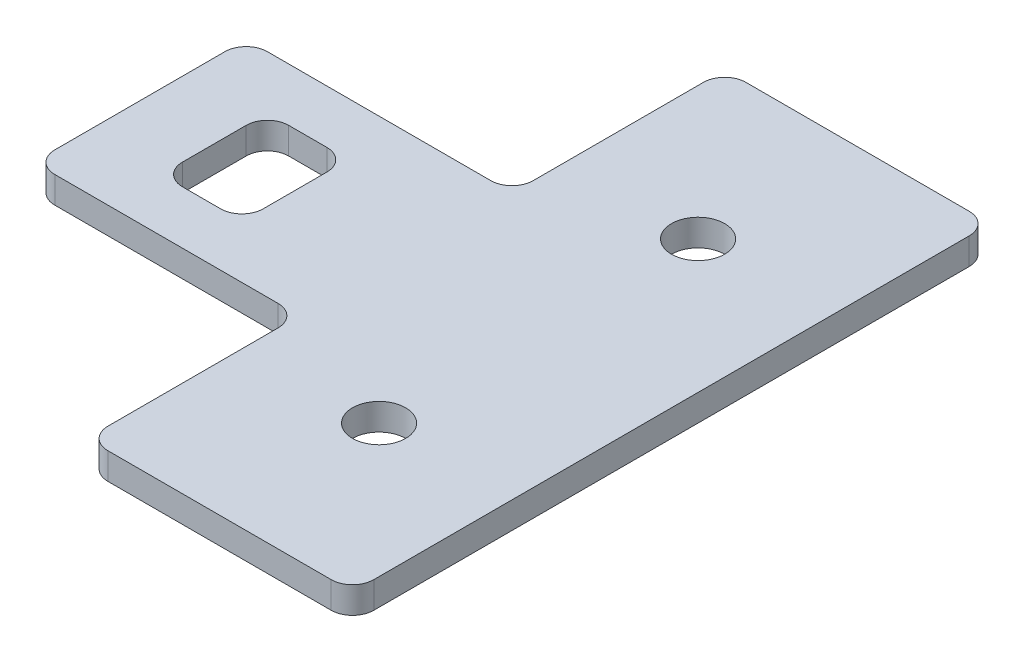
ISO-10303-21;
HEADER;
FILE_DESCRIPTION(('STEP AP214'),'2;1');
FILE_NAME('part.step','',(''),(''),'','','');
FILE_SCHEMA(('AUTOMOTIVE_DESIGN { 1 0 10303 214 1 1 1 1 }'));
ENDSEC;
DATA;
#1=APPLICATION_CONTEXT('core data for automotive mechanical design processes');
#2=APPLICATION_PROTOCOL_DEFINITION('international standard','automotive_design',2000,#1);
#3=PRODUCT_CONTEXT('',#1,'mechanical');
#4=PRODUCT('Part','Part','',(#3));
#5=PRODUCT_RELATED_PRODUCT_CATEGORY('part','',(#4));
#6=PRODUCT_DEFINITION_FORMATION('','',#4);
#7=PRODUCT_DEFINITION_CONTEXT('part definition',#1,'design');
#8=PRODUCT_DEFINITION('design','',#6,#7);
#9=PRODUCT_DEFINITION_SHAPE('','',#8);
#10=(LENGTH_UNIT() NAMED_UNIT(*) SI_UNIT(.MILLI.,.METRE.));
#11=(NAMED_UNIT(*) PLANE_ANGLE_UNIT() SI_UNIT($,.RADIAN.));
#12=(NAMED_UNIT(*) SI_UNIT($,.STERADIAN.) SOLID_ANGLE_UNIT());
#13=UNCERTAINTY_MEASURE_WITH_UNIT(LENGTH_MEASURE(1.E-05),#10,'distance_accuracy_value','');
#14=(GEOMETRIC_REPRESENTATION_CONTEXT(3) GLOBAL_UNCERTAINTY_ASSIGNED_CONTEXT((#13)) GLOBAL_UNIT_ASSIGNED_CONTEXT((#10,
#11,#12)) REPRESENTATION_CONTEXT('',''));
#15=CARTESIAN_POINT('',(0.,0.,0.));
#16=DIRECTION('',(0.,0.,1.));
#17=DIRECTION('',(1.,0.,0.));
#18=AXIS2_PLACEMENT_3D('',#15,#16,#17);
#19=CARTESIAN_POINT('',(-29.21,3.175,10.16));
#20=DIRECTION('',(0.,-1.,0.));
#21=DIRECTION('',(0.,0.,-1.));
#22=AXIS2_PLACEMENT_3D('',#19,#20,#21);
#23=PLANE('',#22);
#24=CARTESIAN_POINT('',(15.875,3.175,19.05));
#25=DIRECTION('',(0.,1.,0.));
#26=DIRECTION('',(0.,0.,-1.));
#27=AXIS2_PLACEMENT_3D('',#24,#25,#26);
#28=CIRCLE('',#27,3.175);
#29=CARTESIAN_POINT('',(15.875,3.175,15.875));
#30=VERTEX_POINT('',#29);
#31=EDGE_CURVE('E263',#30,#30,#28,.T.);
#32=ORIENTED_EDGE('',*,*,#31,.F.);
#33=EDGE_LOOP('',(#32));
#34=FACE_BOUND('',#33,.T.);
#35=CARTESIAN_POINT('',(15.875,3.175,-19.05));
#36=DIRECTION('',(0.,1.,0.));
#37=DIRECTION('',(0.,0.,1.));
#38=AXIS2_PLACEMENT_3D('',#35,#36,#37);
#39=CIRCLE('',#38,3.175);
#40=CARTESIAN_POINT('',(15.875,3.175,-15.875));
#41=VERTEX_POINT('',#40);
#42=EDGE_CURVE('E269',#41,#41,#39,.T.);
#43=ORIENTED_EDGE('',*,*,#42,.F.);
#44=EDGE_LOOP('',(#43));
#45=FACE_BOUND('',#44,.T.);
#46=CARTESIAN_POINT('',(-29.21,3.175,10.16));
#47=DIRECTION('',(0.,1.,0.));
#48=DIRECTION('',(0.,0.,-1.));
#49=AXIS2_PLACEMENT_3D('',#46,#47,#48);
#50=CIRCLE('',#49,2.54);
#51=CARTESIAN_POINT('',(-31.75,3.175,10.16));
#52=VERTEX_POINT('',#51);
#53=CARTESIAN_POINT('',(-29.21,3.175,12.7));
#54=VERTEX_POINT('',#53);
#55=EDGE_CURVE('E275',#52,#54,#50,.T.);
#56=ORIENTED_EDGE('',*,*,#55,.T.);
#57=DIRECTION('',(1.,0.,0.));
#58=VECTOR('',#57,1.);
#59=CARTESIAN_POINT('',(-29.21,3.175,12.7));
#60=LINE('',#59,#58);
#61=CARTESIAN_POINT('',(-2.54000000000003,3.175,12.7));
#62=VERTEX_POINT('',#61);
#63=EDGE_CURVE('E278',#54,#62,#60,.T.);
#64=ORIENTED_EDGE('',*,*,#63,.T.);
#65=CARTESIAN_POINT('',(-2.54000000000001,3.175,15.24));
#66=DIRECTION('',(0.,-1.,0.));
#67=DIRECTION('',(0.,0.,-1.));
#68=AXIS2_PLACEMENT_3D('',#65,#66,#67);
#69=CIRCLE('',#68,2.54);
#70=CARTESIAN_POINT('',(0.,3.175,15.24));
#71=VERTEX_POINT('',#70);
#72=EDGE_CURVE('E281',#62,#71,#69,.T.);
#73=ORIENTED_EDGE('',*,*,#72,.T.);
#74=DIRECTION('',(0.,0.,1.));
#75=VECTOR('',#74,1.);
#76=CARTESIAN_POINT('',(0.,3.175,15.24));
#77=LINE('',#76,#75);
#78=CARTESIAN_POINT('',(0.,3.175,35.56));
#79=VERTEX_POINT('',#78);
#80=EDGE_CURVE('E283',#71,#79,#77,.T.);
#81=ORIENTED_EDGE('',*,*,#80,.T.);
#82=CARTESIAN_POINT('',(2.53999999999999,3.175,35.56));
#83=DIRECTION('',(0.,1.,0.));
#84=DIRECTION('',(0.,0.,1.));
#85=AXIS2_PLACEMENT_3D('',#82,#83,#84);
#86=CIRCLE('',#85,2.54);
#87=CARTESIAN_POINT('',(2.53999999999999,3.175,38.1));
#88=VERTEX_POINT('',#87);
#89=EDGE_CURVE('E285',#79,#88,#86,.T.);
#90=ORIENTED_EDGE('',*,*,#89,.T.);
#91=DIRECTION('',(1.,0.,0.));
#92=VECTOR('',#91,1.);
#93=CARTESIAN_POINT('',(2.54000000000001,3.175,38.1));
#94=LINE('',#93,#92);
#95=CARTESIAN_POINT('',(29.21,3.175,38.1));
#96=VERTEX_POINT('',#95);
#97=EDGE_CURVE('E287',#88,#96,#94,.T.);
#98=ORIENTED_EDGE('',*,*,#97,.T.);
#99=CARTESIAN_POINT('',(29.21,3.175,35.56));
#100=DIRECTION('',(0.,1.,0.));
#101=DIRECTION('',(0.,0.,1.));
#102=AXIS2_PLACEMENT_3D('',#99,#100,#101);
#103=CIRCLE('',#102,2.54);
#104=CARTESIAN_POINT('',(31.75,3.175,35.56));
#105=VERTEX_POINT('',#104);
#106=EDGE_CURVE('E289',#96,#105,#103,.T.);
#107=ORIENTED_EDGE('',*,*,#106,.T.);
#108=DIRECTION('',(0.,0.,-1.));
#109=VECTOR('',#108,1.);
#110=CARTESIAN_POINT('',(31.75,3.175,35.56));
#111=LINE('',#110,#109);
#112=CARTESIAN_POINT('',(31.75,3.175,-35.56));
#113=VERTEX_POINT('',#112);
#114=EDGE_CURVE('E291',#105,#113,#111,.T.);
#115=ORIENTED_EDGE('',*,*,#114,.T.);
#116=CARTESIAN_POINT('',(29.21,3.175,-35.56));
#117=DIRECTION('',(0.,1.,0.));
#118=DIRECTION('',(0.,0.,-1.));
#119=AXIS2_PLACEMENT_3D('',#116,#117,#118);
#120=CIRCLE('',#119,2.54);
#121=CARTESIAN_POINT('',(29.21,3.175,-38.1));
#122=VERTEX_POINT('',#121);
#123=EDGE_CURVE('E293',#113,#122,#120,.T.);
#124=ORIENTED_EDGE('',*,*,#123,.T.);
#125=DIRECTION('',(-1.,0.,0.));
#126=VECTOR('',#125,1.);
#127=CARTESIAN_POINT('',(2.54000000000001,3.175,-38.1));
#128=LINE('',#127,#126);
#129=CARTESIAN_POINT('',(2.54000000000001,3.175,-38.1));
#130=VERTEX_POINT('',#129);
#131=EDGE_CURVE('E295',#122,#130,#128,.T.);
#132=ORIENTED_EDGE('',*,*,#131,.T.);
#133=CARTESIAN_POINT('',(2.53999999999999,3.175,-35.56));
#134=DIRECTION('',(0.,1.,0.));
#135=DIRECTION('',(0.,0.,-1.));
#136=AXIS2_PLACEMENT_3D('',#133,#134,#135);
#137=CIRCLE('',#136,2.54);
#138=CARTESIAN_POINT('',(0.,3.175,-35.56));
#139=VERTEX_POINT('',#138);
#140=EDGE_CURVE('E297',#130,#139,#137,.T.);
#141=ORIENTED_EDGE('',*,*,#140,.T.);
#142=DIRECTION('',(0.,0.,1.));
#143=VECTOR('',#142,1.);
#144=CARTESIAN_POINT('',(0.,3.175,-15.24));
#145=LINE('',#144,#143);
#146=CARTESIAN_POINT('',(0.,3.175,-15.24));
#147=VERTEX_POINT('',#146);
#148=EDGE_CURVE('E299',#139,#147,#145,.T.);
#149=ORIENTED_EDGE('',*,*,#148,.T.);
#150=CARTESIAN_POINT('',(-2.54000000000001,3.175,-15.24));
#151=DIRECTION('',(0.,-1.,0.));
#152=DIRECTION('',(0.,0.,1.));
#153=AXIS2_PLACEMENT_3D('',#150,#151,#152);
#154=CIRCLE('',#153,2.54);
#155=CARTESIAN_POINT('',(-2.54000000000003,3.175,-12.7));
#156=VERTEX_POINT('',#155);
#157=EDGE_CURVE('E301',#147,#156,#154,.T.);
#158=ORIENTED_EDGE('',*,*,#157,.T.);
#159=DIRECTION('',(-1.,0.,0.));
#160=VECTOR('',#159,1.);
#161=CARTESIAN_POINT('',(-29.21,3.175,-12.7));
#162=LINE('',#161,#160);
#163=CARTESIAN_POINT('',(-29.21,3.175,-12.7));
#164=VERTEX_POINT('',#163);
#165=EDGE_CURVE('E303',#156,#164,#162,.T.);
#166=ORIENTED_EDGE('',*,*,#165,.T.);
#167=CARTESIAN_POINT('',(-29.21,3.175,-10.16));
#168=DIRECTION('',(0.,1.,0.));
#169=DIRECTION('',(0.,0.,1.));
#170=AXIS2_PLACEMENT_3D('',#167,#168,#169);
#171=CIRCLE('',#170,2.54);
#172=CARTESIAN_POINT('',(-31.75,3.175,-10.16));
#173=VERTEX_POINT('',#172);
#174=EDGE_CURVE('E305',#164,#173,#171,.T.);
#175=ORIENTED_EDGE('',*,*,#174,.T.);
#176=DIRECTION('',(0.,0.,1.));
#177=VECTOR('',#176,1.);
#178=CARTESIAN_POINT('',(-31.75,3.175,10.16));
#179=LINE('',#178,#177);
#180=EDGE_CURVE('E307',#173,#52,#179,.T.);
#181=ORIENTED_EDGE('',*,*,#180,.T.);
#182=EDGE_LOOP('',(#56,#64,#73,#81,#90,#98,#107,#115,#124,#132,#141,#149,#158,#166,#175,#181));
#183=FACE_BOUND('',#182,.T.);
#184=CARTESIAN_POINT('',(-20.32,3.175,3.81000000000003));
#185=DIRECTION('',(0.,1.,0.));
#186=DIRECTION('',(0.,0.,-1.));
#187=AXIS2_PLACEMENT_3D('',#184,#185,#186);
#188=CIRCLE('',#187,2.54);
#189=CARTESIAN_POINT('',(-22.86,3.175,3.81000000000001));
#190=VERTEX_POINT('',#189);
#191=CARTESIAN_POINT('',(-20.32,3.175,6.35000000000003));
#192=VERTEX_POINT('',#191);
#193=EDGE_CURVE('E198',#190,#192,#188,.T.);
#194=ORIENTED_EDGE('',*,*,#193,.F.);
#195=DIRECTION('',(0.,0.,1.));
#196=VECTOR('',#195,1.);
#197=CARTESIAN_POINT('',(-22.86,3.175,3.81000000000001));
#198=LINE('',#197,#196);
#199=CARTESIAN_POINT('',(-22.86,3.175,-3.80999999999996));
#200=VERTEX_POINT('',#199);
#201=EDGE_CURVE('E231',#200,#190,#198,.T.);
#202=ORIENTED_EDGE('',*,*,#201,.F.);
#203=CARTESIAN_POINT('',(-20.32,3.175,-3.80999999999997));
#204=DIRECTION('',(0.,1.,0.));
#205=DIRECTION('',(0.,0.,-1.));
#206=AXIS2_PLACEMENT_3D('',#203,#204,#205);
#207=CIRCLE('',#206,2.54);
#208=CARTESIAN_POINT('',(-20.32,3.175,-6.34999999999997));
#209=VERTEX_POINT('',#208);
#210=EDGE_CURVE('E229',#209,#200,#207,.T.);
#211=ORIENTED_EDGE('',*,*,#210,.F.);
#212=DIRECTION('',(-1.,0.,0.));
#213=VECTOR('',#212,1.);
#214=CARTESIAN_POINT('',(-20.32,3.175,-6.34999999999997));
#215=LINE('',#214,#213);
#216=CARTESIAN_POINT('',(-15.748,3.175,-6.34999999999998));
#217=VERTEX_POINT('',#216);
#218=EDGE_CURVE('E227',#217,#209,#215,.T.);
#219=ORIENTED_EDGE('',*,*,#218,.F.);
#220=CARTESIAN_POINT('',(-15.748,3.175,-3.80999999999998));
#221=DIRECTION('',(0.,1.,0.));
#222=DIRECTION('',(0.,0.,-1.));
#223=AXIS2_PLACEMENT_3D('',#220,#221,#222);
#224=CIRCLE('',#223,2.54);
#225=CARTESIAN_POINT('',(-13.208,3.175,-3.80999999999996));
#226=VERTEX_POINT('',#225);
#227=EDGE_CURVE('E225',#226,#217,#224,.T.);
#228=ORIENTED_EDGE('',*,*,#227,.F.);
#229=DIRECTION('',(0.,0.,-1.));
#230=VECTOR('',#229,1.);
#231=CARTESIAN_POINT('',(-13.208,3.175,3.81));
#232=LINE('',#231,#230);
#233=CARTESIAN_POINT('',(-13.208,3.175,3.81));
#234=VERTEX_POINT('',#233);
#235=EDGE_CURVE('E221',#234,#226,#232,.T.);
#236=ORIENTED_EDGE('',*,*,#235,.F.);
#237=CARTESIAN_POINT('',(-15.748,3.175,3.81000000000002));
#238=DIRECTION('',(0.,1.,0.));
#239=DIRECTION('',(0.,0.,1.));
#240=AXIS2_PLACEMENT_3D('',#237,#238,#239);
#241=CIRCLE('',#240,2.54);
#242=CARTESIAN_POINT('',(-15.748,3.175,6.35000000000002));
#243=VERTEX_POINT('',#242);
#244=EDGE_CURVE('E219',#243,#234,#241,.T.);
#245=ORIENTED_EDGE('',*,*,#244,.F.);
#246=DIRECTION('',(1.,0.,0.));
#247=VECTOR('',#246,1.);
#248=CARTESIAN_POINT('',(-20.32,3.175,6.35000000000003));
#249=LINE('',#248,#247);
#250=EDGE_CURVE('E206',#192,#243,#249,.T.);
#251=ORIENTED_EDGE('',*,*,#250,.F.);
#252=EDGE_LOOP('',(#194,#202,#211,#219,#228,#236,#245,#251));
#253=FACE_BOUND('',#252,.T.);
#254=ADVANCED_FACE('F37',(#34,#45,#183,#253),#23,.F.);
#255=CARTESIAN_POINT('',(-29.21,0.,10.16));
#256=DIRECTION('',(0.,-1.,0.));
#257=DIRECTION('',(0.,0.,-1.));
#258=AXIS2_PLACEMENT_3D('',#255,#256,#257);
#259=PLANE('',#258);
#260=CARTESIAN_POINT('',(15.875,0.,-19.05));
#261=DIRECTION('',(0.,1.,0.));
#262=DIRECTION('',(0.,0.,1.));
#263=AXIS2_PLACEMENT_3D('',#260,#261,#262);
#264=CIRCLE('',#263,3.175);
#265=CARTESIAN_POINT('',(15.875,0.,-15.875));
#266=VERTEX_POINT('',#265);
#267=EDGE_CURVE('E266',#266,#266,#264,.T.);
#268=ORIENTED_EDGE('',*,*,#267,.T.);
#269=EDGE_LOOP('',(#268));
#270=FACE_BOUND('',#269,.T.);
#271=CARTESIAN_POINT('',(-29.21,0.,10.16));
#272=DIRECTION('',(0.,1.,0.));
#273=DIRECTION('',(0.,0.,-1.));
#274=AXIS2_PLACEMENT_3D('',#271,#272,#273);
#275=CIRCLE('',#274,2.54);
#276=CARTESIAN_POINT('',(-31.75,0.,10.16));
#277=VERTEX_POINT('',#276);
#278=CARTESIAN_POINT('',(-29.21,0.,12.7));
#279=VERTEX_POINT('',#278);
#280=EDGE_CURVE('E272',#277,#279,#275,.T.);
#281=ORIENTED_EDGE('',*,*,#280,.F.);
#282=DIRECTION('',(0.,0.,1.));
#283=VECTOR('',#282,1.);
#284=CARTESIAN_POINT('',(-31.75,0.,10.16));
#285=LINE('',#284,#283);
#286=CARTESIAN_POINT('',(-31.75,0.,-10.16));
#287=VERTEX_POINT('',#286);
#288=EDGE_CURVE('E279',#287,#277,#285,.T.);
#289=ORIENTED_EDGE('',*,*,#288,.F.);
#290=CARTESIAN_POINT('',(-29.21,0.,-10.16));
#291=DIRECTION('',(0.,1.,0.));
#292=DIRECTION('',(0.,0.,1.));
#293=AXIS2_PLACEMENT_3D('',#290,#291,#292);
#294=CIRCLE('',#293,2.54);
#295=CARTESIAN_POINT('',(-29.21,0.,-12.7));
#296=VERTEX_POINT('',#295);
#297=EDGE_CURVE('E338',#296,#287,#294,.T.);
#298=ORIENTED_EDGE('',*,*,#297,.F.);
#299=DIRECTION('',(-1.,0.,0.));
#300=VECTOR('',#299,1.);
#301=CARTESIAN_POINT('',(-29.21,0.,-12.7));
#302=LINE('',#301,#300);
#303=CARTESIAN_POINT('',(-2.54000000000003,0.,-12.7));
#304=VERTEX_POINT('',#303);
#305=EDGE_CURVE('E336',#304,#296,#302,.T.);
#306=ORIENTED_EDGE('',*,*,#305,.F.);
#307=CARTESIAN_POINT('',(-2.54000000000001,0.,-15.24));
#308=DIRECTION('',(0.,-1.,0.));
#309=DIRECTION('',(0.,0.,1.));
#310=AXIS2_PLACEMENT_3D('',#307,#308,#309);
#311=CIRCLE('',#310,2.54);
#312=CARTESIAN_POINT('',(0.,0.,-15.24));
#313=VERTEX_POINT('',#312);
#314=EDGE_CURVE('E334',#313,#304,#311,.T.);
#315=ORIENTED_EDGE('',*,*,#314,.F.);
#316=DIRECTION('',(0.,0.,1.));
#317=VECTOR('',#316,1.);
#318=CARTESIAN_POINT('',(0.,0.,-15.24));
#319=LINE('',#318,#317);
#320=CARTESIAN_POINT('',(0.,0.,-35.56));
#321=VERTEX_POINT('',#320);
#322=EDGE_CURVE('E332',#321,#313,#319,.T.);
#323=ORIENTED_EDGE('',*,*,#322,.F.);
#324=CARTESIAN_POINT('',(2.53999999999999,0.,-35.56));
#325=DIRECTION('',(0.,1.,0.));
#326=DIRECTION('',(0.,0.,-1.));
#327=AXIS2_PLACEMENT_3D('',#324,#325,#326);
#328=CIRCLE('',#327,2.54);
#329=CARTESIAN_POINT('',(2.54000000000001,0.,-38.1));
#330=VERTEX_POINT('',#329);
#331=EDGE_CURVE('E330',#330,#321,#328,.T.);
#332=ORIENTED_EDGE('',*,*,#331,.F.);
#333=DIRECTION('',(-1.,0.,0.));
#334=VECTOR('',#333,1.);
#335=CARTESIAN_POINT('',(2.54000000000001,0.,-38.1));
#336=LINE('',#335,#334);
#337=CARTESIAN_POINT('',(29.21,0.,-38.1));
#338=VERTEX_POINT('',#337);
#339=EDGE_CURVE('E328',#338,#330,#336,.T.);
#340=ORIENTED_EDGE('',*,*,#339,.F.);
#341=CARTESIAN_POINT('',(29.21,0.,-35.56));
#342=DIRECTION('',(0.,1.,0.));
#343=DIRECTION('',(0.,0.,-1.));
#344=AXIS2_PLACEMENT_3D('',#341,#342,#343);
#345=CIRCLE('',#344,2.54);
#346=CARTESIAN_POINT('',(31.75,0.,-35.56));
#347=VERTEX_POINT('',#346);
#348=EDGE_CURVE('E326',#347,#338,#345,.T.);
#349=ORIENTED_EDGE('',*,*,#348,.F.);
#350=DIRECTION('',(0.,0.,-1.));
#351=VECTOR('',#350,1.);
#352=CARTESIAN_POINT('',(31.75,0.,35.56));
#353=LINE('',#352,#351);
#354=CARTESIAN_POINT('',(31.75,0.,35.56));
#355=VERTEX_POINT('',#354);
#356=EDGE_CURVE('E324',#355,#347,#353,.T.);
#357=ORIENTED_EDGE('',*,*,#356,.F.);
#358=CARTESIAN_POINT('',(29.21,0.,35.56));
#359=DIRECTION('',(0.,1.,0.));
#360=DIRECTION('',(0.,0.,1.));
#361=AXIS2_PLACEMENT_3D('',#358,#359,#360);
#362=CIRCLE('',#361,2.54);
#363=CARTESIAN_POINT('',(29.21,0.,38.1));
#364=VERTEX_POINT('',#363);
#365=EDGE_CURVE('E322',#364,#355,#362,.T.);
#366=ORIENTED_EDGE('',*,*,#365,.F.);
#367=DIRECTION('',(1.,0.,0.));
#368=VECTOR('',#367,1.);
#369=CARTESIAN_POINT('',(2.54000000000001,0.,38.1));
#370=LINE('',#369,#368);
#371=CARTESIAN_POINT('',(2.53999999999999,0.,38.1));
#372=VERTEX_POINT('',#371);
#373=EDGE_CURVE('E320',#372,#364,#370,.T.);
#374=ORIENTED_EDGE('',*,*,#373,.F.);
#375=CARTESIAN_POINT('',(2.53999999999999,0.,35.56));
#376=DIRECTION('',(0.,1.,0.));
#377=DIRECTION('',(0.,0.,1.));
#378=AXIS2_PLACEMENT_3D('',#375,#376,#377);
#379=CIRCLE('',#378,2.54);
#380=CARTESIAN_POINT('',(0.,0.,35.56));
#381=VERTEX_POINT('',#380);
#382=EDGE_CURVE('E318',#381,#372,#379,.T.);
#383=ORIENTED_EDGE('',*,*,#382,.F.);
#384=DIRECTION('',(0.,0.,1.));
#385=VECTOR('',#384,1.);
#386=CARTESIAN_POINT('',(0.,0.,15.24));
#387=LINE('',#386,#385);
#388=CARTESIAN_POINT('',(0.,0.,15.24));
#389=VERTEX_POINT('',#388);
#390=EDGE_CURVE('E316',#389,#381,#387,.T.);
#391=ORIENTED_EDGE('',*,*,#390,.F.);
#392=CARTESIAN_POINT('',(-2.54000000000001,0.,15.24));
#393=DIRECTION('',(0.,-1.,0.));
#394=DIRECTION('',(0.,0.,-1.));
#395=AXIS2_PLACEMENT_3D('',#392,#393,#394);
#396=CIRCLE('',#395,2.54);
#397=CARTESIAN_POINT('',(-2.54000000000003,0.,12.7));
#398=VERTEX_POINT('',#397);
#399=EDGE_CURVE('E314',#398,#389,#396,.T.);
#400=ORIENTED_EDGE('',*,*,#399,.F.);
#401=DIRECTION('',(1.,0.,0.));
#402=VECTOR('',#401,1.);
#403=CARTESIAN_POINT('',(-29.21,0.,12.7));
#404=LINE('',#403,#402);
#405=EDGE_CURVE('E312',#279,#398,#404,.T.);
#406=ORIENTED_EDGE('',*,*,#405,.F.);
#407=EDGE_LOOP('',(#281,#289,#298,#306,#315,#323,#332,#340,#349,#357,#366,#374,#383,#391,#400,#406));
#408=FACE_BOUND('',#407,.T.);
#409=CARTESIAN_POINT('',(15.875,0.,19.05));
#410=DIRECTION('',(0.,1.,0.));
#411=DIRECTION('',(0.,0.,-1.));
#412=AXIS2_PLACEMENT_3D('',#409,#410,#411);
#413=CIRCLE('',#412,3.175);
#414=CARTESIAN_POINT('',(15.875,0.,15.875));
#415=VERTEX_POINT('',#414);
#416=EDGE_CURVE('E214',#415,#415,#413,.T.);
#417=ORIENTED_EDGE('',*,*,#416,.T.);
#418=EDGE_LOOP('',(#417));
#419=FACE_BOUND('',#418,.T.);
#420=DIRECTION('',(0.,0.,1.));
#421=VECTOR('',#420,1.);
#422=CARTESIAN_POINT('',(-22.86,0.,3.81000000000001));
#423=LINE('',#422,#421);
#424=CARTESIAN_POINT('',(-22.86,0.,-3.80999999999996));
#425=VERTEX_POINT('',#424);
#426=CARTESIAN_POINT('',(-22.86,0.,3.81000000000001));
#427=VERTEX_POINT('',#426);
#428=EDGE_CURVE('E207',#425,#427,#423,.T.);
#429=ORIENTED_EDGE('',*,*,#428,.T.);
#430=CARTESIAN_POINT('',(-20.32,0.,3.81000000000003));
#431=DIRECTION('',(0.,1.,0.));
#432=DIRECTION('',(0.,0.,-1.));
#433=AXIS2_PLACEMENT_3D('',#430,#431,#432);
#434=CIRCLE('',#433,2.54);
#435=CARTESIAN_POINT('',(-20.32,0.,6.35000000000003));
#436=VERTEX_POINT('',#435);
#437=EDGE_CURVE('E60',#427,#436,#434,.T.);
#438=ORIENTED_EDGE('',*,*,#437,.T.);
#439=DIRECTION('',(1.,0.,0.));
#440=VECTOR('',#439,1.);
#441=CARTESIAN_POINT('',(-20.32,0.,6.35000000000003));
#442=LINE('',#441,#440);
#443=CARTESIAN_POINT('',(-15.748,0.,6.35000000000002));
#444=VERTEX_POINT('',#443);
#445=EDGE_CURVE('E213',#436,#444,#442,.T.);
#446=ORIENTED_EDGE('',*,*,#445,.T.);
#447=CARTESIAN_POINT('',(-15.748,0.,3.81000000000002));
#448=DIRECTION('',(0.,1.,0.));
#449=DIRECTION('',(0.,0.,1.));
#450=AXIS2_PLACEMENT_3D('',#447,#448,#449);
#451=CIRCLE('',#450,2.54);
#452=CARTESIAN_POINT('',(-13.208,0.,3.81));
#453=VERTEX_POINT('',#452);
#454=EDGE_CURVE('E235',#444,#453,#451,.T.);
#455=ORIENTED_EDGE('',*,*,#454,.T.);
#456=DIRECTION('',(0.,0.,-1.));
#457=VECTOR('',#456,1.);
#458=CARTESIAN_POINT('',(-13.208,0.,3.81));
#459=LINE('',#458,#457);
#460=CARTESIAN_POINT('',(-13.208,0.,-3.80999999999996));
#461=VERTEX_POINT('',#460);
#462=EDGE_CURVE('E238',#453,#461,#459,.T.);
#463=ORIENTED_EDGE('',*,*,#462,.T.);
#464=CARTESIAN_POINT('',(-15.748,0.,-3.80999999999998));
#465=DIRECTION('',(0.,1.,0.));
#466=DIRECTION('',(0.,0.,-1.));
#467=AXIS2_PLACEMENT_3D('',#464,#465,#466);
#468=CIRCLE('',#467,2.54);
#469=CARTESIAN_POINT('',(-15.748,0.,-6.34999999999998));
#470=VERTEX_POINT('',#469);
#471=EDGE_CURVE('E241',#461,#470,#468,.T.);
#472=ORIENTED_EDGE('',*,*,#471,.T.);
#473=DIRECTION('',(-1.,0.,0.));
#474=VECTOR('',#473,1.);
#475=CARTESIAN_POINT('',(-20.32,0.,-6.34999999999997));
#476=LINE('',#475,#474);
#477=CARTESIAN_POINT('',(-20.32,0.,-6.34999999999997));
#478=VERTEX_POINT('',#477);
#479=EDGE_CURVE('E244',#470,#478,#476,.T.);
#480=ORIENTED_EDGE('',*,*,#479,.T.);
#481=CARTESIAN_POINT('',(-20.32,0.,-3.80999999999997));
#482=DIRECTION('',(0.,1.,0.));
#483=DIRECTION('',(0.,0.,-1.));
#484=AXIS2_PLACEMENT_3D('',#481,#482,#483);
#485=CIRCLE('',#484,2.54);
#486=EDGE_CURVE('E247',#478,#425,#485,.T.);
#487=ORIENTED_EDGE('',*,*,#486,.T.);
#488=EDGE_LOOP('',(#429,#438,#446,#455,#463,#472,#480,#487));
#489=FACE_BOUND('',#488,.T.);
#490=ADVANCED_FACE('F392',(#270,#408,#419,#489),#259,.T.);
#491=CARTESIAN_POINT('',(-29.21,3.175,10.16));
#492=DIRECTION('',(0.,-1.,0.));
#493=DIRECTION('',(0.,0.,-1.));
#494=AXIS2_PLACEMENT_3D('',#491,#492,#493);
#495=CYLINDRICAL_SURFACE('',#494,2.54);
#496=ORIENTED_EDGE('',*,*,#280,.T.);
#497=DIRECTION('',(0.,-1.,0.));
#498=VECTOR('',#497,1.);
#499=CARTESIAN_POINT('',(-29.21,3.175,12.7));
#500=LINE('',#499,#498);
#501=EDGE_CURVE('E11',#54,#279,#500,.T.);
#502=ORIENTED_EDGE('',*,*,#501,.F.);
#503=ORIENTED_EDGE('',*,*,#55,.F.);
#504=DIRECTION('',(0.,-1.,0.));
#505=VECTOR('',#504,1.);
#506=CARTESIAN_POINT('',(-31.75,3.175,10.16));
#507=LINE('',#506,#505);
#508=EDGE_CURVE('E309',#52,#277,#507,.T.);
#509=ORIENTED_EDGE('',*,*,#508,.T.);
#510=EDGE_LOOP('',(#496,#502,#503,#509));
#511=FACE_BOUND('',#510,.T.);
#512=ADVANCED_FACE('F39',(#511),#495,.T.);
#513=CARTESIAN_POINT('',(-29.21,3.175,12.7));
#514=DIRECTION('',(0.,0.,-1.));
#515=DIRECTION('',(-1.,0.,0.));
#516=AXIS2_PLACEMENT_3D('',#513,#514,#515);
#517=PLANE('',#516);
#518=ORIENTED_EDGE('',*,*,#405,.T.);
#519=DIRECTION('',(0.,-1.,0.));
#520=VECTOR('',#519,1.);
#521=CARTESIAN_POINT('',(-2.54000000000003,3.175,12.7));
#522=LINE('',#521,#520);
#523=EDGE_CURVE('E45',#62,#398,#522,.T.);
#524=ORIENTED_EDGE('',*,*,#523,.F.);
#525=ORIENTED_EDGE('',*,*,#63,.F.);
#526=ORIENTED_EDGE('',*,*,#501,.T.);
#527=EDGE_LOOP('',(#518,#524,#525,#526));
#528=FACE_BOUND('',#527,.T.);
#529=ADVANCED_FACE('F409',(#528),#517,.F.);
#530=CARTESIAN_POINT('',(-2.54000000000001,3.175,15.24));
#531=DIRECTION('',(0.,-1.,0.));
#532=DIRECTION('',(0.,0.,-1.));
#533=AXIS2_PLACEMENT_3D('',#530,#531,#532);
#534=CYLINDRICAL_SURFACE('',#533,2.54);
#535=ORIENTED_EDGE('',*,*,#399,.T.);
#536=DIRECTION('',(0.,-1.,0.));
#537=VECTOR('',#536,1.);
#538=CARTESIAN_POINT('',(0.,3.175,15.24));
#539=LINE('',#538,#537);
#540=EDGE_CURVE('E379',#71,#389,#539,.T.);
#541=ORIENTED_EDGE('',*,*,#540,.F.);
#542=ORIENTED_EDGE('',*,*,#72,.F.);
#543=ORIENTED_EDGE('',*,*,#523,.T.);
#544=EDGE_LOOP('',(#535,#541,#542,#543));
#545=FACE_BOUND('',#544,.T.);
#546=ADVANCED_FACE('F386',(#545),#534,.F.);
#547=CARTESIAN_POINT('',(0.,3.175,15.24));
#548=DIRECTION('',(1.,0.,0.));
#549=DIRECTION('',(0.,0.,-1.));
#550=AXIS2_PLACEMENT_3D('',#547,#548,#549);
#551=PLANE('',#550);
#552=ORIENTED_EDGE('',*,*,#390,.T.);
#553=DIRECTION('',(0.,-1.,0.));
#554=VECTOR('',#553,1.);
#555=CARTESIAN_POINT('',(0.,3.175,35.56));
#556=LINE('',#555,#554);
#557=EDGE_CURVE('E376',#79,#381,#556,.T.);
#558=ORIENTED_EDGE('',*,*,#557,.F.);
#559=ORIENTED_EDGE('',*,*,#80,.F.);
#560=ORIENTED_EDGE('',*,*,#540,.T.);
#561=EDGE_LOOP('',(#552,#558,#559,#560));
#562=FACE_BOUND('',#561,.T.);
#563=ADVANCED_FACE('F398',(#562),#551,.F.);
#564=CARTESIAN_POINT('',(2.53999999999999,3.175,35.56));
#565=DIRECTION('',(0.,-1.,0.));
#566=DIRECTION('',(0.,0.,-1.));
#567=AXIS2_PLACEMENT_3D('',#564,#565,#566);
#568=CYLINDRICAL_SURFACE('',#567,2.54);
#569=ORIENTED_EDGE('',*,*,#382,.T.);
#570=DIRECTION('',(0.,-1.,0.));
#571=VECTOR('',#570,1.);
#572=CARTESIAN_POINT('',(2.53999999999999,3.175,38.1));
#573=LINE('',#572,#571);
#574=EDGE_CURVE('E373',#88,#372,#573,.T.);
#575=ORIENTED_EDGE('',*,*,#574,.F.);
#576=ORIENTED_EDGE('',*,*,#89,.F.);
#577=ORIENTED_EDGE('',*,*,#557,.T.);
#578=EDGE_LOOP('',(#569,#575,#576,#577));
#579=FACE_BOUND('',#578,.T.);
#580=ADVANCED_FACE('F402',(#579),#568,.T.);
#581=CARTESIAN_POINT('',(2.54000000000001,3.175,38.1));
#582=DIRECTION('',(0.,0.,-1.));
#583=DIRECTION('',(-1.,0.,0.));
#584=AXIS2_PLACEMENT_3D('',#581,#582,#583);
#585=PLANE('',#584);
#586=ORIENTED_EDGE('',*,*,#373,.T.);
#587=DIRECTION('',(0.,-1.,0.));
#588=VECTOR('',#587,1.);
#589=CARTESIAN_POINT('',(29.21,3.175,38.1));
#590=LINE('',#589,#588);
#591=EDGE_CURVE('E370',#96,#364,#590,.T.);
#592=ORIENTED_EDGE('',*,*,#591,.F.);
#593=ORIENTED_EDGE('',*,*,#97,.F.);
#594=ORIENTED_EDGE('',*,*,#574,.T.);
#595=EDGE_LOOP('',(#586,#592,#593,#594));
#596=FACE_BOUND('',#595,.T.);
#597=ADVANCED_FACE('F462',(#596),#585,.F.);
#598=CARTESIAN_POINT('',(29.21,3.175,35.56));
#599=DIRECTION('',(0.,-1.,0.));
#600=DIRECTION('',(0.,0.,-1.));
#601=AXIS2_PLACEMENT_3D('',#598,#599,#600);
#602=CYLINDRICAL_SURFACE('',#601,2.54);
#603=ORIENTED_EDGE('',*,*,#365,.T.);
#604=DIRECTION('',(0.,-1.,0.));
#605=VECTOR('',#604,1.);
#606=CARTESIAN_POINT('',(31.75,3.175,35.56));
#607=LINE('',#606,#605);
#608=EDGE_CURVE('E367',#105,#355,#607,.T.);
#609=ORIENTED_EDGE('',*,*,#608,.F.);
#610=ORIENTED_EDGE('',*,*,#106,.F.);
#611=ORIENTED_EDGE('',*,*,#591,.T.);
#612=EDGE_LOOP('',(#603,#609,#610,#611));
#613=FACE_BOUND('',#612,.T.);
#614=ADVANCED_FACE('F459',(#613),#602,.T.);
#615=CARTESIAN_POINT('',(31.75,3.175,35.56));
#616=DIRECTION('',(-1.,0.,0.));
#617=DIRECTION('',(0.,0.,1.));
#618=AXIS2_PLACEMENT_3D('',#615,#616,#617);
#619=PLANE('',#618);
#620=ORIENTED_EDGE('',*,*,#356,.T.);
#621=DIRECTION('',(0.,-1.,0.));
#622=VECTOR('',#621,1.);
#623=CARTESIAN_POINT('',(31.75,3.175,-35.56));
#624=LINE('',#623,#622);
#625=EDGE_CURVE('E364',#113,#347,#624,.T.);
#626=ORIENTED_EDGE('',*,*,#625,.F.);
#627=ORIENTED_EDGE('',*,*,#114,.F.);
#628=ORIENTED_EDGE('',*,*,#608,.T.);
#629=EDGE_LOOP('',(#620,#626,#627,#628));
#630=FACE_BOUND('',#629,.T.);
#631=ADVANCED_FACE('F455',(#630),#619,.F.);
#632=CARTESIAN_POINT('',(29.21,3.175,-35.56));
#633=DIRECTION('',(0.,-1.,0.));
#634=DIRECTION('',(0.,0.,-1.));
#635=AXIS2_PLACEMENT_3D('',#632,#633,#634);
#636=CYLINDRICAL_SURFACE('',#635,2.54);
#637=ORIENTED_EDGE('',*,*,#348,.T.);
#638=DIRECTION('',(0.,-1.,0.));
#639=VECTOR('',#638,1.);
#640=CARTESIAN_POINT('',(29.21,3.175,-38.1));
#641=LINE('',#640,#639);
#642=EDGE_CURVE('E361',#122,#338,#641,.T.);
#643=ORIENTED_EDGE('',*,*,#642,.F.);
#644=ORIENTED_EDGE('',*,*,#123,.F.);
#645=ORIENTED_EDGE('',*,*,#625,.T.);
#646=EDGE_LOOP('',(#637,#643,#644,#645));
#647=FACE_BOUND('',#646,.T.);
#648=ADVANCED_FACE('F451',(#647),#636,.T.);
#649=CARTESIAN_POINT('',(2.54000000000001,3.175,-38.1));
#650=DIRECTION('',(0.,0.,1.));
#651=DIRECTION('',(1.,0.,0.));
#652=AXIS2_PLACEMENT_3D('',#649,#650,#651);
#653=PLANE('',#652);
#654=ORIENTED_EDGE('',*,*,#339,.T.);
#655=DIRECTION('',(0.,-1.,0.));
#656=VECTOR('',#655,1.);
#657=CARTESIAN_POINT('',(2.54000000000001,3.175,-38.1));
#658=LINE('',#657,#656);
#659=EDGE_CURVE('E358',#130,#330,#658,.T.);
#660=ORIENTED_EDGE('',*,*,#659,.F.);
#661=ORIENTED_EDGE('',*,*,#131,.F.);
#662=ORIENTED_EDGE('',*,*,#642,.T.);
#663=EDGE_LOOP('',(#654,#660,#661,#662));
#664=FACE_BOUND('',#663,.T.);
#665=ADVANCED_FACE('F446',(#664),#653,.F.);
#666=CARTESIAN_POINT('',(2.53999999999999,3.175,-35.56));
#667=DIRECTION('',(0.,-1.,0.));
#668=DIRECTION('',(0.,0.,-1.));
#669=AXIS2_PLACEMENT_3D('',#666,#667,#668);
#670=CYLINDRICAL_SURFACE('',#669,2.54);
#671=ORIENTED_EDGE('',*,*,#331,.T.);
#672=DIRECTION('',(0.,-1.,0.));
#673=VECTOR('',#672,1.);
#674=CARTESIAN_POINT('',(0.,3.175,-35.56));
#675=LINE('',#674,#673);
#676=EDGE_CURVE('E355',#139,#321,#675,.T.);
#677=ORIENTED_EDGE('',*,*,#676,.F.);
#678=ORIENTED_EDGE('',*,*,#140,.F.);
#679=ORIENTED_EDGE('',*,*,#659,.T.);
#680=EDGE_LOOP('',(#671,#677,#678,#679));
#681=FACE_BOUND('',#680,.T.);
#682=ADVANCED_FACE('F440',(#681),#670,.T.);
#683=CARTESIAN_POINT('',(0.,3.175,-15.24));
#684=DIRECTION('',(1.,0.,0.));
#685=DIRECTION('',(0.,0.,-1.));
#686=AXIS2_PLACEMENT_3D('',#683,#684,#685);
#687=PLANE('',#686);
#688=ORIENTED_EDGE('',*,*,#322,.T.);
#689=DIRECTION('',(0.,-1.,0.));
#690=VECTOR('',#689,1.);
#691=CARTESIAN_POINT('',(0.,3.175,-15.24));
#692=LINE('',#691,#690);
#693=EDGE_CURVE('E352',#147,#313,#692,.T.);
#694=ORIENTED_EDGE('',*,*,#693,.F.);
#695=ORIENTED_EDGE('',*,*,#148,.F.);
#696=ORIENTED_EDGE('',*,*,#676,.T.);
#697=EDGE_LOOP('',(#688,#694,#695,#696));
#698=FACE_BOUND('',#697,.T.);
#699=ADVANCED_FACE('F436',(#698),#687,.F.);
#700=CARTESIAN_POINT('',(-2.54000000000001,3.175,-15.24));
#701=DIRECTION('',(0.,-1.,0.));
#702=DIRECTION('',(0.,0.,-1.));
#703=AXIS2_PLACEMENT_3D('',#700,#701,#702);
#704=CYLINDRICAL_SURFACE('',#703,2.54);
#705=ORIENTED_EDGE('',*,*,#314,.T.);
#706=DIRECTION('',(0.,-1.,0.));
#707=VECTOR('',#706,1.);
#708=CARTESIAN_POINT('',(-2.54000000000003,3.175,-12.7));
#709=LINE('',#708,#707);
#710=EDGE_CURVE('E349',#156,#304,#709,.T.);
#711=ORIENTED_EDGE('',*,*,#710,.F.);
#712=ORIENTED_EDGE('',*,*,#157,.F.);
#713=ORIENTED_EDGE('',*,*,#693,.T.);
#714=EDGE_LOOP('',(#705,#711,#712,#713));
#715=FACE_BOUND('',#714,.T.);
#716=ADVANCED_FACE('F431',(#715),#704,.F.);
#717=CARTESIAN_POINT('',(-29.21,3.175,-12.7));
#718=DIRECTION('',(0.,0.,1.));
#719=DIRECTION('',(1.,0.,0.));
#720=AXIS2_PLACEMENT_3D('',#717,#718,#719);
#721=PLANE('',#720);
#722=ORIENTED_EDGE('',*,*,#305,.T.);
#723=DIRECTION('',(0.,-1.,0.));
#724=VECTOR('',#723,1.);
#725=CARTESIAN_POINT('',(-29.21,3.175,-12.7));
#726=LINE('',#725,#724);
#727=EDGE_CURVE('E346',#164,#296,#726,.T.);
#728=ORIENTED_EDGE('',*,*,#727,.F.);
#729=ORIENTED_EDGE('',*,*,#165,.F.);
#730=ORIENTED_EDGE('',*,*,#710,.T.);
#731=EDGE_LOOP('',(#722,#728,#729,#730));
#732=FACE_BOUND('',#731,.T.);
#733=ADVANCED_FACE('F425',(#732),#721,.F.);
#734=CARTESIAN_POINT('',(-29.21,3.175,-10.16));
#735=DIRECTION('',(0.,-1.,0.));
#736=DIRECTION('',(0.,0.,-1.));
#737=AXIS2_PLACEMENT_3D('',#734,#735,#736);
#738=CYLINDRICAL_SURFACE('',#737,2.54);
#739=ORIENTED_EDGE('',*,*,#297,.T.);
#740=DIRECTION('',(0.,-1.,0.));
#741=VECTOR('',#740,1.);
#742=CARTESIAN_POINT('',(-31.75,3.175,-10.16));
#743=LINE('',#742,#741);
#744=EDGE_CURVE('E343',#173,#287,#743,.T.);
#745=ORIENTED_EDGE('',*,*,#744,.F.);
#746=ORIENTED_EDGE('',*,*,#174,.F.);
#747=ORIENTED_EDGE('',*,*,#727,.T.);
#748=EDGE_LOOP('',(#739,#745,#746,#747));
#749=FACE_BOUND('',#748,.T.);
#750=ADVANCED_FACE('F421',(#749),#738,.T.);
#751=CARTESIAN_POINT('',(-31.75,3.175,10.16));
#752=DIRECTION('',(1.,0.,0.));
#753=DIRECTION('',(0.,0.,-1.));
#754=AXIS2_PLACEMENT_3D('',#751,#752,#753);
#755=PLANE('',#754);
#756=ORIENTED_EDGE('',*,*,#288,.T.);
#757=ORIENTED_EDGE('',*,*,#508,.F.);
#758=ORIENTED_EDGE('',*,*,#180,.F.);
#759=ORIENTED_EDGE('',*,*,#744,.T.);
#760=EDGE_LOOP('',(#756,#757,#758,#759));
#761=FACE_BOUND('',#760,.T.);
#762=ADVANCED_FACE('F416',(#761),#755,.F.);
#763=CARTESIAN_POINT('',(15.875,3.175,-19.05));
#764=DIRECTION('',(0.,-1.,0.));
#765=DIRECTION('',(0.,0.,-1.));
#766=AXIS2_PLACEMENT_3D('',#763,#764,#765);
#767=CYLINDRICAL_SURFACE('',#766,3.175);
#768=ORIENTED_EDGE('',*,*,#42,.T.);
#769=EDGE_LOOP('',(#768));
#770=FACE_BOUND('',#769,.T.);
#771=ORIENTED_EDGE('',*,*,#267,.F.);
#772=EDGE_LOOP('',(#771));
#773=FACE_BOUND('',#772,.T.);
#774=ADVANCED_FACE('F482',(#770,#773),#767,.F.);
#775=CARTESIAN_POINT('',(15.875,3.175,19.05));
#776=DIRECTION('',(0.,-1.,0.));
#777=DIRECTION('',(0.,0.,-1.));
#778=AXIS2_PLACEMENT_3D('',#775,#776,#777);
#779=CYLINDRICAL_SURFACE('',#778,3.175);
#780=ORIENTED_EDGE('',*,*,#31,.T.);
#781=EDGE_LOOP('',(#780));
#782=FACE_BOUND('',#781,.T.);
#783=ORIENTED_EDGE('',*,*,#416,.F.);
#784=EDGE_LOOP('',(#783));
#785=FACE_BOUND('',#784,.T.);
#786=ADVANCED_FACE('F544',(#782,#785),#779,.F.);
#787=CARTESIAN_POINT('',(-20.32,3.175,3.81000000000003));
#788=DIRECTION('',(0.,-1.,0.));
#789=DIRECTION('',(0.,0.,-1.));
#790=AXIS2_PLACEMENT_3D('',#787,#788,#789);
#791=CYLINDRICAL_SURFACE('',#790,2.54);
#792=ORIENTED_EDGE('',*,*,#437,.F.);
#793=DIRECTION('',(0.,-1.,0.));
#794=VECTOR('',#793,1.);
#795=CARTESIAN_POINT('',(-22.86,3.175,3.81000000000001));
#796=LINE('',#795,#794);
#797=EDGE_CURVE('E202',#190,#427,#796,.T.);
#798=ORIENTED_EDGE('',*,*,#797,.F.);
#799=ORIENTED_EDGE('',*,*,#193,.T.);
#800=DIRECTION('',(0.,-1.,0.));
#801=VECTOR('',#800,1.);
#802=CARTESIAN_POINT('',(-20.32,3.175,6.35000000000003));
#803=LINE('',#802,#801);
#804=EDGE_CURVE('E201',#192,#436,#803,.T.);
#805=ORIENTED_EDGE('',*,*,#804,.T.);
#806=EDGE_LOOP('',(#792,#798,#799,#805));
#807=FACE_BOUND('',#806,.T.);
#808=ADVANCED_FACE('F200',(#807),#791,.F.);
#809=CARTESIAN_POINT('',(-20.32,3.175,6.35000000000003));
#810=DIRECTION('',(0.,0.,-1.));
#811=DIRECTION('',(-1.,0.,0.));
#812=AXIS2_PLACEMENT_3D('',#809,#810,#811);
#813=PLANE('',#812);
#814=ORIENTED_EDGE('',*,*,#445,.F.);
#815=ORIENTED_EDGE('',*,*,#804,.F.);
#816=ORIENTED_EDGE('',*,*,#250,.T.);
#817=DIRECTION('',(0.,-1.,0.));
#818=VECTOR('',#817,1.);
#819=CARTESIAN_POINT('',(-15.748,3.175,6.35000000000002));
#820=LINE('',#819,#818);
#821=EDGE_CURVE('E215',#243,#444,#820,.T.);
#822=ORIENTED_EDGE('',*,*,#821,.T.);
#823=EDGE_LOOP('',(#814,#815,#816,#822));
#824=FACE_BOUND('',#823,.T.);
#825=ADVANCED_FACE('F210',(#824),#813,.T.);
#826=CARTESIAN_POINT('',(-15.748,3.175,3.81000000000002));
#827=DIRECTION('',(0.,-1.,0.));
#828=DIRECTION('',(0.,0.,-1.));
#829=AXIS2_PLACEMENT_3D('',#826,#827,#828);
#830=CYLINDRICAL_SURFACE('',#829,2.54);
#831=ORIENTED_EDGE('',*,*,#454,.F.);
#832=ORIENTED_EDGE('',*,*,#821,.F.);
#833=ORIENTED_EDGE('',*,*,#244,.T.);
#834=DIRECTION('',(0.,-1.,0.));
#835=VECTOR('',#834,1.);
#836=CARTESIAN_POINT('',(-13.208,3.175,3.81));
#837=LINE('',#836,#835);
#838=EDGE_CURVE('E260',#234,#453,#837,.T.);
#839=ORIENTED_EDGE('',*,*,#838,.T.);
#840=EDGE_LOOP('',(#831,#832,#833,#839));
#841=FACE_BOUND('',#840,.T.);
#842=ADVANCED_FACE('F563',(#841),#830,.F.);
#843=CARTESIAN_POINT('',(-13.208,3.175,3.81));
#844=DIRECTION('',(-1.,0.,0.));
#845=DIRECTION('',(0.,0.,1.));
#846=AXIS2_PLACEMENT_3D('',#843,#844,#845);
#847=PLANE('',#846);
#848=ORIENTED_EDGE('',*,*,#462,.F.);
#849=ORIENTED_EDGE('',*,*,#838,.F.);
#850=ORIENTED_EDGE('',*,*,#235,.T.);
#851=DIRECTION('',(0.,-1.,0.));
#852=VECTOR('',#851,1.);
#853=CARTESIAN_POINT('',(-13.208,3.175,-3.80999999999996));
#854=LINE('',#853,#852);
#855=EDGE_CURVE('E258',#226,#461,#854,.T.);
#856=ORIENTED_EDGE('',*,*,#855,.T.);
#857=EDGE_LOOP('',(#848,#849,#850,#856));
#858=FACE_BOUND('',#857,.T.);
#859=ADVANCED_FACE('F570',(#858),#847,.T.);
#860=CARTESIAN_POINT('',(-15.748,3.175,-3.80999999999998));
#861=DIRECTION('',(0.,-1.,0.));
#862=DIRECTION('',(0.,0.,-1.));
#863=AXIS2_PLACEMENT_3D('',#860,#861,#862);
#864=CYLINDRICAL_SURFACE('',#863,2.54);
#865=ORIENTED_EDGE('',*,*,#471,.F.);
#866=ORIENTED_EDGE('',*,*,#855,.F.);
#867=ORIENTED_EDGE('',*,*,#227,.T.);
#868=DIRECTION('',(0.,-1.,0.));
#869=VECTOR('',#868,1.);
#870=CARTESIAN_POINT('',(-15.748,3.175,-6.34999999999998));
#871=LINE('',#870,#869);
#872=EDGE_CURVE('E256',#217,#470,#871,.T.);
#873=ORIENTED_EDGE('',*,*,#872,.T.);
#874=EDGE_LOOP('',(#865,#866,#867,#873));
#875=FACE_BOUND('',#874,.T.);
#876=ADVANCED_FACE('F578',(#875),#864,.F.);
#877=CARTESIAN_POINT('',(-20.32,3.175,-6.34999999999997));
#878=DIRECTION('',(0.,0.,1.));
#879=DIRECTION('',(1.,0.,0.));
#880=AXIS2_PLACEMENT_3D('',#877,#878,#879);
#881=PLANE('',#880);
#882=ORIENTED_EDGE('',*,*,#479,.F.);
#883=ORIENTED_EDGE('',*,*,#872,.F.);
#884=ORIENTED_EDGE('',*,*,#218,.T.);
#885=DIRECTION('',(0.,-1.,0.));
#886=VECTOR('',#885,1.);
#887=CARTESIAN_POINT('',(-20.32,3.175,-6.34999999999997));
#888=LINE('',#887,#886);
#889=EDGE_CURVE('E254',#209,#478,#888,.T.);
#890=ORIENTED_EDGE('',*,*,#889,.T.);
#891=EDGE_LOOP('',(#882,#883,#884,#890));
#892=FACE_BOUND('',#891,.T.);
#893=ADVANCED_FACE('F586',(#892),#881,.T.);
#894=CARTESIAN_POINT('',(-20.32,3.175,-3.80999999999997));
#895=DIRECTION('',(0.,-1.,0.));
#896=DIRECTION('',(0.,0.,-1.));
#897=AXIS2_PLACEMENT_3D('',#894,#895,#896);
#898=CYLINDRICAL_SURFACE('',#897,2.54);
#899=ORIENTED_EDGE('',*,*,#486,.F.);
#900=ORIENTED_EDGE('',*,*,#889,.F.);
#901=ORIENTED_EDGE('',*,*,#210,.T.);
#902=DIRECTION('',(0.,-1.,0.));
#903=VECTOR('',#902,1.);
#904=CARTESIAN_POINT('',(-22.86,3.175,-3.80999999999996));
#905=LINE('',#904,#903);
#906=EDGE_CURVE('E52',#200,#425,#905,.T.);
#907=ORIENTED_EDGE('',*,*,#906,.T.);
#908=EDGE_LOOP('',(#899,#900,#901,#907));
#909=FACE_BOUND('',#908,.T.);
#910=ADVANCED_FACE('F594',(#909),#898,.F.);
#911=CARTESIAN_POINT('',(-22.86,3.175,3.81000000000001));
#912=DIRECTION('',(1.,0.,0.));
#913=DIRECTION('',(0.,0.,-1.));
#914=AXIS2_PLACEMENT_3D('',#911,#912,#913);
#915=PLANE('',#914);
#916=ORIENTED_EDGE('',*,*,#428,.F.);
#917=ORIENTED_EDGE('',*,*,#906,.F.);
#918=ORIENTED_EDGE('',*,*,#201,.T.);
#919=ORIENTED_EDGE('',*,*,#797,.T.);
#920=EDGE_LOOP('',(#916,#917,#918,#919));
#921=FACE_BOUND('',#920,.T.);
#922=ADVANCED_FACE('F602',(#921),#915,.T.);
#923=CLOSED_SHELL('',(#254,#490,#512,#529,#546,#563,#580,#597,#614,#631,#648,#665,#682,#699,
#716,#733,#750,#762,#774,#786,#808,#825,#842,#859,#876,#893,#910,#922));
#924=MANIFOLD_SOLID_BREP('B2',#923);
#925=ADVANCED_BREP_SHAPE_REPRESENTATION('',(#18,#924),#14);
#926=SHAPE_DEFINITION_REPRESENTATION(#9,#925);
ENDSEC;
END-ISO-10303-21;
